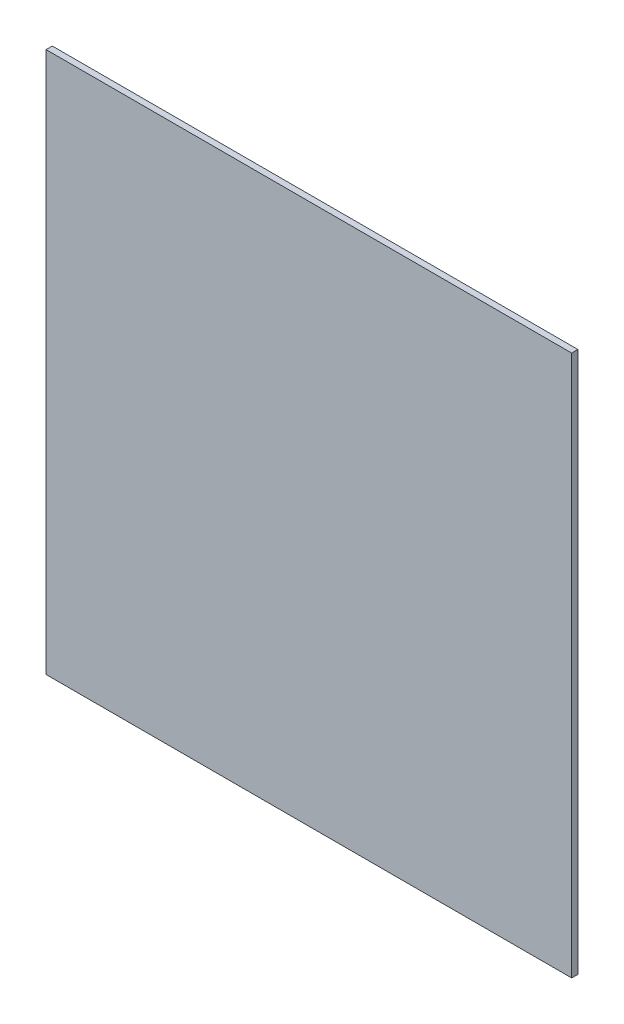
ISO-10303-21;
HEADER;
FILE_DESCRIPTION(('STEP AP214'),'2;1');
FILE_NAME('part.step','',(''),(''),'','','');
FILE_SCHEMA(('AUTOMOTIVE_DESIGN { 1 0 10303 214 1 1 1 1 }'));
ENDSEC;
DATA;
#1=APPLICATION_CONTEXT('core data for automotive mechanical design processes');
#2=APPLICATION_PROTOCOL_DEFINITION('international standard','automotive_design',2000,#1);
#3=PRODUCT_CONTEXT('',#1,'mechanical');
#4=PRODUCT('Part','Part','',(#3));
#5=PRODUCT_RELATED_PRODUCT_CATEGORY('part','',(#4));
#6=PRODUCT_DEFINITION_FORMATION('','',#4);
#7=PRODUCT_DEFINITION_CONTEXT('part definition',#1,'design');
#8=PRODUCT_DEFINITION('design','',#6,#7);
#9=PRODUCT_DEFINITION_SHAPE('','',#8);
#10=(LENGTH_UNIT() NAMED_UNIT(*) SI_UNIT(.MILLI.,.METRE.));
#11=(NAMED_UNIT(*) PLANE_ANGLE_UNIT() SI_UNIT($,.RADIAN.));
#12=(NAMED_UNIT(*) SI_UNIT($,.STERADIAN.) SOLID_ANGLE_UNIT());
#13=UNCERTAINTY_MEASURE_WITH_UNIT(LENGTH_MEASURE(1.E-05),#10,'distance_accuracy_value','');
#14=(GEOMETRIC_REPRESENTATION_CONTEXT(3) GLOBAL_UNCERTAINTY_ASSIGNED_CONTEXT((#13)) GLOBAL_UNIT_ASSIGNED_CONTEXT((#10,
#11,#12)) REPRESENTATION_CONTEXT('',''));
#15=CARTESIAN_POINT('',(0.,0.,0.));
#16=DIRECTION('',(0.,0.,1.));
#17=DIRECTION('',(1.,0.,0.));
#18=AXIS2_PLACEMENT_3D('',#15,#16,#17);
#19=CARTESIAN_POINT('',(169.,-174.,4.));
#20=DIRECTION('',(-1.,0.,0.));
#21=DIRECTION('',(0.,0.,1.));
#22=AXIS2_PLACEMENT_3D('',#19,#20,#21);
#23=PLANE('',#22);
#24=DIRECTION('',(0.,1.,0.));
#25=VECTOR('',#24,1.);
#26=CARTESIAN_POINT('',(169.,-174.,0.));
#27=LINE('',#26,#25);
#28=CARTESIAN_POINT('',(169.,-174.,0.));
#29=VERTEX_POINT('',#28);
#30=CARTESIAN_POINT('',(169.,174.,0.));
#31=VERTEX_POINT('',#30);
#32=EDGE_CURVE('E95',#29,#31,#27,.T.);
#33=ORIENTED_EDGE('',*,*,#32,.T.);
#34=DIRECTION('',(0.,0.,-1.));
#35=VECTOR('',#34,1.);
#36=CARTESIAN_POINT('',(169.,174.,4.));
#37=LINE('',#36,#35);
#38=CARTESIAN_POINT('',(169.,174.,4.));
#39=VERTEX_POINT('',#38);
#40=EDGE_CURVE('E11',#39,#31,#37,.T.);
#41=ORIENTED_EDGE('',*,*,#40,.F.);
#42=DIRECTION('',(0.,1.,0.));
#43=VECTOR('',#42,1.);
#44=CARTESIAN_POINT('',(169.,-174.,4.));
#45=LINE('',#44,#43);
#46=CARTESIAN_POINT('',(169.,-174.,4.));
#47=VERTEX_POINT('',#46);
#48=EDGE_CURVE('E83',#47,#39,#45,.T.);
#49=ORIENTED_EDGE('',*,*,#48,.F.);
#50=DIRECTION('',(0.,0.,-1.));
#51=VECTOR('',#50,1.);
#52=CARTESIAN_POINT('',(169.,-174.,4.));
#53=LINE('',#52,#51);
#54=EDGE_CURVE('E91',#47,#29,#53,.T.);
#55=ORIENTED_EDGE('',*,*,#54,.T.);
#56=EDGE_LOOP('',(#33,#41,#49,#55));
#57=FACE_BOUND('',#56,.T.);
#58=ADVANCED_FACE('F32',(#57),#23,.F.);
#59=CARTESIAN_POINT('',(-169.,174.,4.));
#60=DIRECTION('',(0.,-1.,0.));
#61=DIRECTION('',(0.,0.,-1.));
#62=AXIS2_PLACEMENT_3D('',#59,#60,#61);
#63=PLANE('',#62);
#64=DIRECTION('',(-1.,0.,0.));
#65=VECTOR('',#64,1.);
#66=CARTESIAN_POINT('',(-169.,174.,0.));
#67=LINE('',#66,#65);
#68=CARTESIAN_POINT('',(-169.,174.,0.));
#69=VERTEX_POINT('',#68);
#70=EDGE_CURVE('E87',#31,#69,#67,.T.);
#71=ORIENTED_EDGE('',*,*,#70,.T.);
#72=DIRECTION('',(0.,0.,-1.));
#73=VECTOR('',#72,1.);
#74=CARTESIAN_POINT('',(-169.,174.,4.));
#75=LINE('',#74,#73);
#76=CARTESIAN_POINT('',(-169.,174.,4.));
#77=VERTEX_POINT('',#76);
#78=EDGE_CURVE('E40',#77,#69,#75,.T.);
#79=ORIENTED_EDGE('',*,*,#78,.F.);
#80=DIRECTION('',(-1.,0.,0.));
#81=VECTOR('',#80,1.);
#82=CARTESIAN_POINT('',(-169.,174.,4.));
#83=LINE('',#82,#81);
#84=EDGE_CURVE('E78',#39,#77,#83,.T.);
#85=ORIENTED_EDGE('',*,*,#84,.F.);
#86=ORIENTED_EDGE('',*,*,#40,.T.);
#87=EDGE_LOOP('',(#71,#79,#85,#86));
#88=FACE_BOUND('',#87,.T.);
#89=ADVANCED_FACE('F86',(#88),#63,.F.);
#90=CARTESIAN_POINT('',(-169.,-174.,4.));
#91=DIRECTION('',(1.,0.,0.));
#92=DIRECTION('',(0.,0.,-1.));
#93=AXIS2_PLACEMENT_3D('',#90,#91,#92);
#94=PLANE('',#93);
#95=DIRECTION('',(0.,-1.,0.));
#96=VECTOR('',#95,1.);
#97=CARTESIAN_POINT('',(-169.,-174.,0.));
#98=LINE('',#97,#96);
#99=CARTESIAN_POINT('',(-169.,-174.,0.));
#100=VERTEX_POINT('',#99);
#101=EDGE_CURVE('E65',#69,#100,#98,.T.);
#102=ORIENTED_EDGE('',*,*,#101,.T.);
#103=DIRECTION('',(0.,0.,-1.));
#104=VECTOR('',#103,1.);
#105=CARTESIAN_POINT('',(-169.,-174.,4.));
#106=LINE('',#105,#104);
#107=CARTESIAN_POINT('',(-169.,-174.,4.));
#108=VERTEX_POINT('',#107);
#109=EDGE_CURVE('E88',#108,#100,#106,.T.);
#110=ORIENTED_EDGE('',*,*,#109,.F.);
#111=DIRECTION('',(0.,-1.,0.));
#112=VECTOR('',#111,1.);
#113=CARTESIAN_POINT('',(-169.,-174.,4.));
#114=LINE('',#113,#112);
#115=EDGE_CURVE('E81',#77,#108,#114,.T.);
#116=ORIENTED_EDGE('',*,*,#115,.F.);
#117=ORIENTED_EDGE('',*,*,#78,.T.);
#118=EDGE_LOOP('',(#102,#110,#116,#117));
#119=FACE_BOUND('',#118,.T.);
#120=ADVANCED_FACE('F89',(#119),#94,.F.);
#121=CARTESIAN_POINT('',(-169.,-174.,4.));
#122=DIRECTION('',(0.,1.,0.));
#123=DIRECTION('',(0.,0.,1.));
#124=AXIS2_PLACEMENT_3D('',#121,#122,#123);
#125=PLANE('',#124);
#126=DIRECTION('',(1.,0.,0.));
#127=VECTOR('',#126,1.);
#128=CARTESIAN_POINT('',(-169.,-174.,0.));
#129=LINE('',#128,#127);
#130=EDGE_CURVE('E71',#100,#29,#129,.T.);
#131=ORIENTED_EDGE('',*,*,#130,.T.);
#132=ORIENTED_EDGE('',*,*,#54,.F.);
#133=DIRECTION('',(1.,0.,0.));
#134=VECTOR('',#133,1.);
#135=CARTESIAN_POINT('',(-169.,-174.,4.));
#136=LINE('',#135,#134);
#137=EDGE_CURVE('E48',#108,#47,#136,.T.);
#138=ORIENTED_EDGE('',*,*,#137,.F.);
#139=ORIENTED_EDGE('',*,*,#109,.T.);
#140=EDGE_LOOP('',(#131,#132,#138,#139));
#141=FACE_BOUND('',#140,.T.);
#142=ADVANCED_FACE('F102',(#141),#125,.F.);
#143=CARTESIAN_POINT('',(0.,0.,4.));
#144=DIRECTION('',(0.,0.,-1.));
#145=DIRECTION('',(-1.,0.,0.));
#146=AXIS2_PLACEMENT_3D('',#143,#144,#145);
#147=PLANE('',#146);
#148=ORIENTED_EDGE('',*,*,#48,.T.);
#149=ORIENTED_EDGE('',*,*,#84,.T.);
#150=ORIENTED_EDGE('',*,*,#115,.T.);
#151=ORIENTED_EDGE('',*,*,#137,.T.);
#152=EDGE_LOOP('',(#148,#149,#150,#151));
#153=FACE_BOUND('',#152,.T.);
#154=ADVANCED_FACE('F79',(#153),#147,.F.);
#155=CARTESIAN_POINT('',(0.,0.,0.));
#156=DIRECTION('',(0.,0.,-1.));
#157=DIRECTION('',(-1.,0.,0.));
#158=AXIS2_PLACEMENT_3D('',#155,#156,#157);
#159=PLANE('',#158);
#160=ORIENTED_EDGE('',*,*,#32,.F.);
#161=ORIENTED_EDGE('',*,*,#130,.F.);
#162=ORIENTED_EDGE('',*,*,#101,.F.);
#163=ORIENTED_EDGE('',*,*,#70,.F.);
#164=EDGE_LOOP('',(#160,#161,#162,#163));
#165=FACE_BOUND('',#164,.T.);
#166=ADVANCED_FACE('F105',(#165),#159,.T.);
#167=CLOSED_SHELL('',(#58,#89,#120,#142,#154,#166));
#168=MANIFOLD_SOLID_BREP('B2',#167);
#169=ADVANCED_BREP_SHAPE_REPRESENTATION('',(#18,#168),#14);
#170=SHAPE_DEFINITION_REPRESENTATION(#9,#169);
ENDSEC;
END-ISO-10303-21;
